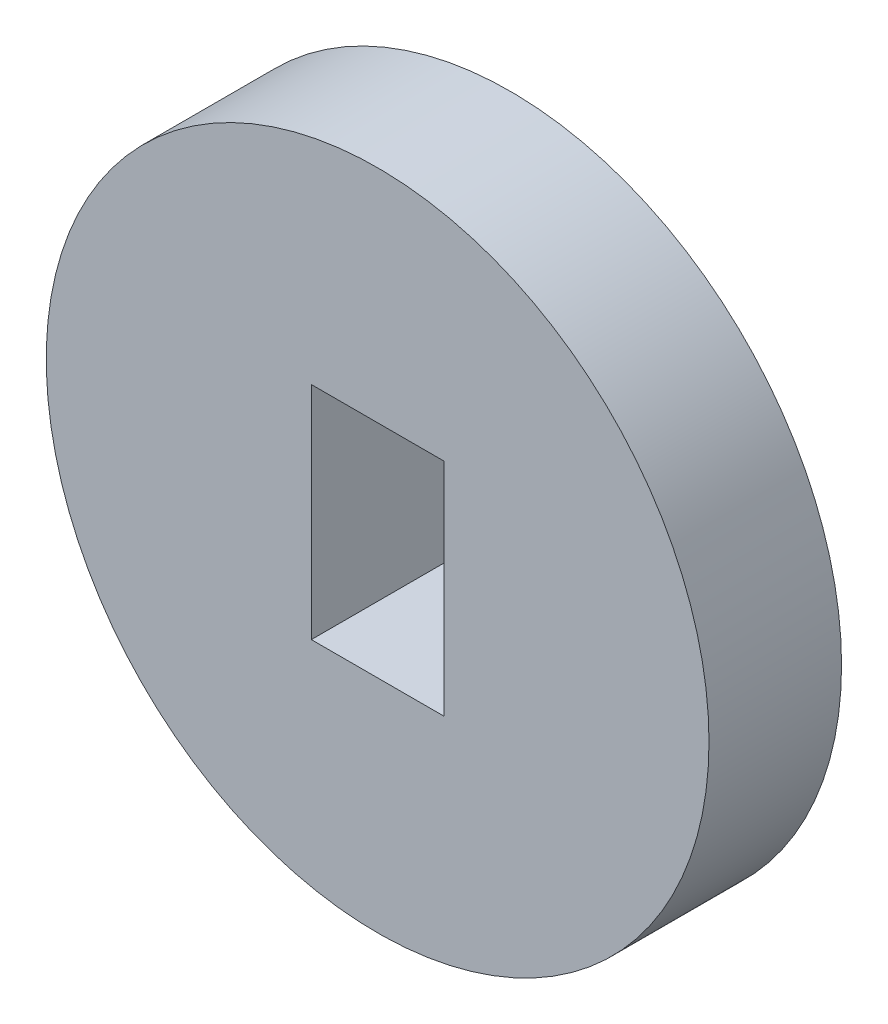
ISO-10303-21;
HEADER;
FILE_DESCRIPTION(('STEP AP214'),'2;1');
FILE_NAME('part.step','',(''),(''),'','','');
FILE_SCHEMA(('AUTOMOTIVE_DESIGN { 1 0 10303 214 1 1 1 1 }'));
ENDSEC;
DATA;
#1=APPLICATION_CONTEXT('core data for automotive mechanical design processes');
#2=APPLICATION_PROTOCOL_DEFINITION('international standard','automotive_design',2000,#1);
#3=PRODUCT_CONTEXT('',#1,'mechanical');
#4=PRODUCT('Part','Part','',(#3));
#5=PRODUCT_RELATED_PRODUCT_CATEGORY('part','',(#4));
#6=PRODUCT_DEFINITION_FORMATION('','',#4);
#7=PRODUCT_DEFINITION_CONTEXT('part definition',#1,'design');
#8=PRODUCT_DEFINITION('design','',#6,#7);
#9=PRODUCT_DEFINITION_SHAPE('','',#8);
#10=(LENGTH_UNIT() NAMED_UNIT(*) SI_UNIT(.MILLI.,.METRE.));
#11=(NAMED_UNIT(*) PLANE_ANGLE_UNIT() SI_UNIT($,.RADIAN.));
#12=(NAMED_UNIT(*) SI_UNIT($,.STERADIAN.) SOLID_ANGLE_UNIT());
#13=UNCERTAINTY_MEASURE_WITH_UNIT(LENGTH_MEASURE(1.E-05),#10,'distance_accuracy_value','');
#14=(GEOMETRIC_REPRESENTATION_CONTEXT(3) GLOBAL_UNCERTAINTY_ASSIGNED_CONTEXT((#13)) GLOBAL_UNIT_ASSIGNED_CONTEXT((#10,
#11,#12)) REPRESENTATION_CONTEXT('',''));
#15=CARTESIAN_POINT('',(0.,0.,0.));
#16=DIRECTION('',(0.,0.,1.));
#17=DIRECTION('',(1.,0.,0.));
#18=AXIS2_PLACEMENT_3D('',#15,#16,#17);
#19=CARTESIAN_POINT('',(0.,0.,6.));
#20=DIRECTION('',(0.,0.,-1.));
#21=DIRECTION('',(-1.,0.,0.));
#22=AXIS2_PLACEMENT_3D('',#19,#20,#21);
#23=CYLINDRICAL_SURFACE('',#22,15.);
#24=CARTESIAN_POINT('',(0.,0.,6.));
#25=DIRECTION('',(0.,0.,1.));
#26=DIRECTION('',(1.,0.,0.));
#27=AXIS2_PLACEMENT_3D('',#24,#25,#26);
#28=CIRCLE('',#27,15.);
#29=CARTESIAN_POINT('',(15.,0.,6.));
#30=VERTEX_POINT('',#29);
#31=EDGE_CURVE('E11',#30,#30,#28,.T.);
#32=ORIENTED_EDGE('',*,*,#31,.F.);
#33=EDGE_LOOP('',(#32));
#34=FACE_BOUND('',#33,.T.);
#35=CARTESIAN_POINT('',(0.,0.,0.));
#36=DIRECTION('',(0.,0.,1.));
#37=DIRECTION('',(1.,0.,0.));
#38=AXIS2_PLACEMENT_3D('',#35,#36,#37);
#39=CIRCLE('',#38,15.);
#40=CARTESIAN_POINT('',(15.,0.,0.));
#41=VERTEX_POINT('',#40);
#42=EDGE_CURVE('E42',#41,#41,#39,.T.);
#43=ORIENTED_EDGE('',*,*,#42,.T.);
#44=EDGE_LOOP('',(#43));
#45=FACE_BOUND('',#44,.T.);
#46=ADVANCED_FACE('F39',(#34,#45),#23,.T.);
#47=CARTESIAN_POINT('',(0.,0.,6.));
#48=DIRECTION('',(0.,0.,1.));
#49=DIRECTION('',(1.,0.,0.));
#50=AXIS2_PLACEMENT_3D('',#47,#48,#49);
#51=PLANE('',#50);
#52=DIRECTION('',(0.,-1.,0.));
#53=VECTOR('',#52,1.);
#54=CARTESIAN_POINT('',(-3.,-5.,6.));
#55=LINE('',#54,#53);
#56=CARTESIAN_POINT('',(-3.,5.,6.));
#57=VERTEX_POINT('',#56);
#58=CARTESIAN_POINT('',(-3.,-5.,6.));
#59=VERTEX_POINT('',#58);
#60=EDGE_CURVE('E54',#57,#59,#55,.T.);
#61=ORIENTED_EDGE('',*,*,#60,.F.);
#62=DIRECTION('',(-1.,0.,0.));
#63=VECTOR('',#62,1.);
#64=CARTESIAN_POINT('',(3.,5.,6.));
#65=LINE('',#64,#63);
#66=CARTESIAN_POINT('',(3.,5.,6.));
#67=VERTEX_POINT('',#66);
#68=EDGE_CURVE('E101',#67,#57,#65,.T.);
#69=ORIENTED_EDGE('',*,*,#68,.F.);
#70=DIRECTION('',(0.,1.,0.));
#71=VECTOR('',#70,1.);
#72=CARTESIAN_POINT('',(3.,-5.,6.));
#73=LINE('',#72,#71);
#74=CARTESIAN_POINT('',(3.,-5.,6.));
#75=VERTEX_POINT('',#74);
#76=EDGE_CURVE('E105',#75,#67,#73,.T.);
#77=ORIENTED_EDGE('',*,*,#76,.F.);
#78=DIRECTION('',(1.,0.,0.));
#79=VECTOR('',#78,1.);
#80=CARTESIAN_POINT('',(3.,-5.,6.));
#81=LINE('',#80,#79);
#82=EDGE_CURVE('E114',#59,#75,#81,.T.);
#83=ORIENTED_EDGE('',*,*,#82,.F.);
#84=EDGE_LOOP('',(#61,#69,#77,#83));
#85=FACE_BOUND('',#84,.T.);
#86=ORIENTED_EDGE('',*,*,#31,.T.);
#87=EDGE_LOOP('',(#86));
#88=FACE_BOUND('',#87,.T.);
#89=ADVANCED_FACE('F131',(#85,#88),#51,.T.);
#90=CARTESIAN_POINT('',(0.,0.,0.));
#91=DIRECTION('',(0.,0.,1.));
#92=DIRECTION('',(1.,0.,0.));
#93=AXIS2_PLACEMENT_3D('',#90,#91,#92);
#94=PLANE('',#93);
#95=DIRECTION('',(-1.,0.,0.));
#96=VECTOR('',#95,1.);
#97=CARTESIAN_POINT('',(3.,5.,0.));
#98=LINE('',#97,#96);
#99=CARTESIAN_POINT('',(3.,5.,0.));
#100=VERTEX_POINT('',#99);
#101=CARTESIAN_POINT('',(-3.,5.,0.));
#102=VERTEX_POINT('',#101);
#103=EDGE_CURVE('E89',#100,#102,#98,.T.);
#104=ORIENTED_EDGE('',*,*,#103,.T.);
#105=DIRECTION('',(0.,-1.,0.));
#106=VECTOR('',#105,1.);
#107=CARTESIAN_POINT('',(-3.,-5.,0.));
#108=LINE('',#107,#106);
#109=CARTESIAN_POINT('',(-3.,-5.,0.));
#110=VERTEX_POINT('',#109);
#111=EDGE_CURVE('E82',#102,#110,#108,.T.);
#112=ORIENTED_EDGE('',*,*,#111,.T.);
#113=DIRECTION('',(1.,0.,0.));
#114=VECTOR('',#113,1.);
#115=CARTESIAN_POINT('',(3.,-5.,0.));
#116=LINE('',#115,#114);
#117=CARTESIAN_POINT('',(3.,-5.,0.));
#118=VERTEX_POINT('',#117);
#119=EDGE_CURVE('E92',#110,#118,#116,.T.);
#120=ORIENTED_EDGE('',*,*,#119,.T.);
#121=DIRECTION('',(0.,1.,0.));
#122=VECTOR('',#121,1.);
#123=CARTESIAN_POINT('',(3.,-5.,0.));
#124=LINE('',#123,#122);
#125=EDGE_CURVE('E62',#118,#100,#124,.T.);
#126=ORIENTED_EDGE('',*,*,#125,.T.);
#127=EDGE_LOOP('',(#104,#112,#120,#126));
#128=FACE_BOUND('',#127,.T.);
#129=ORIENTED_EDGE('',*,*,#42,.F.);
#130=EDGE_LOOP('',(#129));
#131=FACE_BOUND('',#130,.T.);
#132=ADVANCED_FACE('F97',(#128,#131),#94,.F.);
#133=CARTESIAN_POINT('',(-3.,-5.,0.));
#134=DIRECTION('',(-1.,0.,0.));
#135=DIRECTION('',(0.,0.,1.));
#136=AXIS2_PLACEMENT_3D('',#133,#134,#135);
#137=PLANE('',#136);
#138=ORIENTED_EDGE('',*,*,#60,.T.);
#139=DIRECTION('',(0.,0.,1.));
#140=VECTOR('',#139,1.);
#141=CARTESIAN_POINT('',(-3.,-5.,0.));
#142=LINE('',#141,#140);
#143=EDGE_CURVE('E78',#110,#59,#142,.T.);
#144=ORIENTED_EDGE('',*,*,#143,.F.);
#145=ORIENTED_EDGE('',*,*,#111,.F.);
#146=DIRECTION('',(0.,0.,1.));
#147=VECTOR('',#146,1.);
#148=CARTESIAN_POINT('',(-3.,5.,0.));
#149=LINE('',#148,#147);
#150=EDGE_CURVE('E120',#102,#57,#149,.T.);
#151=ORIENTED_EDGE('',*,*,#150,.T.);
#152=EDGE_LOOP('',(#138,#144,#145,#151));
#153=FACE_BOUND('',#152,.T.);
#154=ADVANCED_FACE('F80',(#153),#137,.F.);
#155=CARTESIAN_POINT('',(3.,5.,0.));
#156=DIRECTION('',(0.,1.,0.));
#157=DIRECTION('',(-1.,0.,0.));
#158=AXIS2_PLACEMENT_3D('',#155,#156,#157);
#159=PLANE('',#158);
#160=ORIENTED_EDGE('',*,*,#68,.T.);
#161=ORIENTED_EDGE('',*,*,#150,.F.);
#162=ORIENTED_EDGE('',*,*,#103,.F.);
#163=DIRECTION('',(0.,0.,1.));
#164=VECTOR('',#163,1.);
#165=CARTESIAN_POINT('',(3.,5.,0.));
#166=LINE('',#165,#164);
#167=EDGE_CURVE('E123',#100,#67,#166,.T.);
#168=ORIENTED_EDGE('',*,*,#167,.T.);
#169=EDGE_LOOP('',(#160,#161,#162,#168));
#170=FACE_BOUND('',#169,.T.);
#171=ADVANCED_FACE('F134',(#170),#159,.F.);
#172=CARTESIAN_POINT('',(3.,-5.,0.));
#173=DIRECTION('',(1.,0.,0.));
#174=DIRECTION('',(0.,0.,-1.));
#175=AXIS2_PLACEMENT_3D('',#172,#173,#174);
#176=PLANE('',#175);
#177=ORIENTED_EDGE('',*,*,#76,.T.);
#178=ORIENTED_EDGE('',*,*,#167,.F.);
#179=ORIENTED_EDGE('',*,*,#125,.F.);
#180=DIRECTION('',(0.,0.,1.));
#181=VECTOR('',#180,1.);
#182=CARTESIAN_POINT('',(3.,-5.,0.));
#183=LINE('',#182,#181);
#184=EDGE_CURVE('E88',#118,#75,#183,.T.);
#185=ORIENTED_EDGE('',*,*,#184,.T.);
#186=EDGE_LOOP('',(#177,#178,#179,#185));
#187=FACE_BOUND('',#186,.T.);
#188=ADVANCED_FACE('F127',(#187),#176,.F.);
#189=CARTESIAN_POINT('',(3.,-5.,0.));
#190=DIRECTION('',(0.,-1.,0.));
#191=DIRECTION('',(1.,0.,0.));
#192=AXIS2_PLACEMENT_3D('',#189,#190,#191);
#193=PLANE('',#192);
#194=ORIENTED_EDGE('',*,*,#82,.T.);
#195=ORIENTED_EDGE('',*,*,#184,.F.);
#196=ORIENTED_EDGE('',*,*,#119,.F.);
#197=ORIENTED_EDGE('',*,*,#143,.T.);
#198=EDGE_LOOP('',(#194,#195,#196,#197));
#199=FACE_BOUND('',#198,.T.);
#200=ADVANCED_FACE('F93',(#199),#193,.F.);
#201=CLOSED_SHELL('',(#46,#89,#132,#154,#171,#188,#200));
#202=MANIFOLD_SOLID_BREP('B2',#201);
#203=ADVANCED_BREP_SHAPE_REPRESENTATION('',(#18,#202),#14);
#204=SHAPE_DEFINITION_REPRESENTATION(#9,#203);
ENDSEC;
END-ISO-10303-21;
